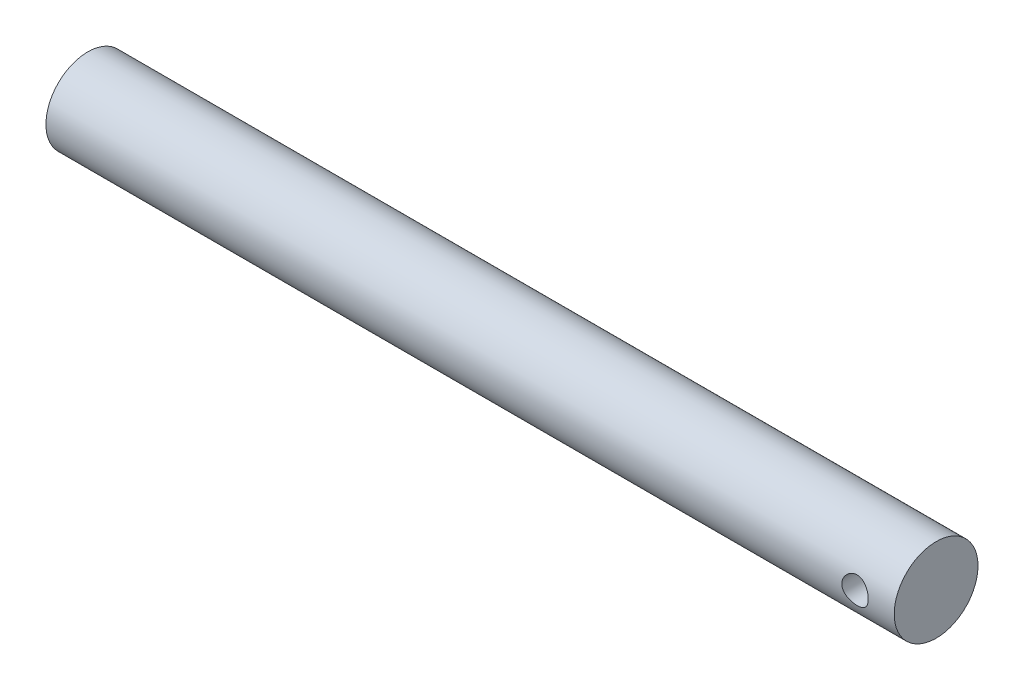
ISO-10303-21;
HEADER;
FILE_DESCRIPTION(('STEP AP214'),'2;1');
FILE_NAME('part.step','',(''),(''),'','','');
FILE_SCHEMA(('AUTOMOTIVE_DESIGN { 1 0 10303 214 1 1 1 1 }'));
ENDSEC;
DATA;
#1=APPLICATION_CONTEXT('core data for automotive mechanical design processes');
#2=APPLICATION_PROTOCOL_DEFINITION('international standard','automotive_design',2000,#1);
#3=PRODUCT_CONTEXT('',#1,'mechanical');
#4=PRODUCT('Part','Part','',(#3));
#5=PRODUCT_RELATED_PRODUCT_CATEGORY('part','',(#4));
#6=PRODUCT_DEFINITION_FORMATION('','',#4);
#7=PRODUCT_DEFINITION_CONTEXT('part definition',#1,'design');
#8=PRODUCT_DEFINITION('design','',#6,#7);
#9=PRODUCT_DEFINITION_SHAPE('','',#8);
#10=(LENGTH_UNIT() NAMED_UNIT(*) SI_UNIT(.MILLI.,.METRE.));
#11=(NAMED_UNIT(*) PLANE_ANGLE_UNIT() SI_UNIT($,.RADIAN.));
#12=(NAMED_UNIT(*) SI_UNIT($,.STERADIAN.) SOLID_ANGLE_UNIT());
#13=UNCERTAINTY_MEASURE_WITH_UNIT(LENGTH_MEASURE(1.E-05),#10,'distance_accuracy_value','');
#14=(GEOMETRIC_REPRESENTATION_CONTEXT(3) GLOBAL_UNCERTAINTY_ASSIGNED_CONTEXT((#13)) GLOBAL_UNIT_ASSIGNED_CONTEXT((#10,
#11,#12)) REPRESENTATION_CONTEXT('',''));
#15=CARTESIAN_POINT('',(0.,0.,0.));
#16=DIRECTION('',(0.,0.,1.));
#17=DIRECTION('',(1.,0.,0.));
#18=AXIS2_PLACEMENT_3D('',#15,#16,#17);
#19=CARTESIAN_POINT('',(203.2,0.,0.));
#20=DIRECTION('',(-1.,0.,0.));
#21=DIRECTION('',(0.,0.,1.));
#22=AXIS2_PLACEMENT_3D('',#19,#20,#21);
#23=CYLINDRICAL_SURFACE('',#22,10.033);
#24=CARTESIAN_POINT('',(196.977,0.,10.033));
#25=CARTESIAN_POINT('',(196.976999202598,-0.173724762827523,10.0329993597286));
#26=CARTESIAN_POINT('',(196.962694713612,-0.347458330826656,10.0284454349368));
#27=CARTESIAN_POINT('',(196.906009308974,-0.689837921385933,10.0107255184516));
#28=CARTESIAN_POINT('',(196.863622685165,-0.858482902318582,9.99755777586446));
#29=CARTESIAN_POINT('',(196.752350423952,-1.18569893455665,9.9640472849707));
#30=CARTESIAN_POINT('',(196.683506418906,-1.34428535915392,9.94371581340308));
#31=CARTESIAN_POINT('',(196.521452811089,-1.64766312119923,9.89797263047599));
#32=CARTESIAN_POINT('',(196.428239181954,-1.79245217363855,9.87256007978108));
#33=CARTESIAN_POINT('',(196.216994332223,-2.06869900766257,9.8184501603642));
#34=CARTESIAN_POINT('',(196.098332201369,-2.19965999348186,9.78967987955622));
#35=CARTESIAN_POINT('',(195.840901681813,-2.44019422634966,9.73251540764313));
#36=CARTESIAN_POINT('',(195.702129437195,-2.54976336224417,9.70412128980567));
#37=CARTESIAN_POINT('',(195.404085424461,-2.74712351592384,9.65013802368304));
#38=CARTESIAN_POINT('',(195.24438180378,-2.83428926593633,9.62463866003324));
#39=CARTESIAN_POINT('',(194.911644957712,-2.9803181516747,9.58043089482933));
#40=CARTESIAN_POINT('',(194.738615360298,-3.03918895926478,9.56172065281666));
#41=CARTESIAN_POINT('',(194.389752628873,-3.12513046595421,9.53397317415864));
#42=CARTESIAN_POINT('',(194.214169863087,-3.15312450269746,9.52465583640759));
#43=CARTESIAN_POINT('',(193.860571560782,-3.1794028380917,9.51591803804279));
#44=CARTESIAN_POINT('',(193.682556703338,-3.17769526704059,9.51649486907204));
#45=CARTESIAN_POINT('',(193.336828242823,-3.14534005043219,9.52723331949479));
#46=CARTESIAN_POINT('',(193.168990075437,-3.11587182116769,9.53700430424162));
#47=CARTESIAN_POINT('',(192.840774479841,-3.03074622038652,9.56439466851856));
#48=CARTESIAN_POINT('',(192.680397865074,-2.97508600079147,9.58201490155323));
#49=CARTESIAN_POINT('',(192.368872487517,-2.83833493613629,9.62341384316104));
#50=CARTESIAN_POINT('',(192.217896751812,-2.75687765598894,9.64728037174124));
#51=CARTESIAN_POINT('',(191.931372766981,-2.57109919369587,9.69844315263238));
#52=CARTESIAN_POINT('',(191.795828625182,-2.46677194591434,9.7257403140041));
#53=CARTESIAN_POINT('',(191.537354998608,-2.23245035707077,9.78225018249642));
#54=CARTESIAN_POINT('',(191.415311512894,-2.10148407823555,9.81149278113296));
#55=CARTESIAN_POINT('',(191.194701235263,-1.82058059851052,9.86747479007084));
#56=CARTESIAN_POINT('',(191.096136272302,-1.67064192108008,9.89421400526244));
#57=CARTESIAN_POINT('',(190.924660015046,-1.35431067811256,9.94246966128009));
#58=CARTESIAN_POINT('',(190.851964857105,-1.1877937096163,9.96394165412304));
#59=CARTESIAN_POINT('',(190.735883028316,-0.844056124776923,9.9989224262251));
#60=CARTESIAN_POINT('',(190.692487221851,-0.666838863607496,10.0124336874946));
#61=CARTESIAN_POINT('',(190.637756361389,-0.314248115446341,10.0295690639536));
#62=CARTESIAN_POINT('',(190.625222302901,-0.139078435551168,10.0335627369056));
#63=CARTESIAN_POINT('',(190.629183683093,0.210882754898693,10.0323087902416));
#64=CARTESIAN_POINT('',(190.645674760864,0.385674318313354,10.0270625588833));
#65=CARTESIAN_POINT('',(190.706258154418,0.725260604850788,10.0081613548351));
#66=CARTESIAN_POINT('',(190.749632858837,0.890196703486057,9.99472514878789));
#67=CARTESIAN_POINT('',(190.861872639422,1.21040074708556,9.96102205245852));
#68=CARTESIAN_POINT('',(190.930740886829,1.36566748643207,9.94075431240322));
#69=CARTESIAN_POINT('',(191.093916348603,1.6664030968329,9.89484295136149));
#70=CARTESIAN_POINT('',(191.188811224405,1.81153417504005,9.86907864631155));
#71=CARTESIAN_POINT('',(191.400643981747,2.08421228994196,9.81511591431324));
#72=CARTESIAN_POINT('',(191.51758798539,2.2117544258676,9.78691681250723));
#73=CARTESIAN_POINT('',(191.775839627443,2.45102525037071,9.72981619972594));
#74=CARTESIAN_POINT('',(191.917945154146,2.56189905066963,9.70093281275661));
#75=CARTESIAN_POINT('',(192.219371608827,2.75830840151296,9.64692879179202));
#76=CARTESIAN_POINT('',(192.378692330306,2.84384425594351,9.62180811267119));
#77=CARTESIAN_POINT('',(192.709763177556,2.98663912236098,9.57844759898918));
#78=CARTESIAN_POINT('',(192.881466293699,3.04399922774385,9.56018322077986));
#79=CARTESIAN_POINT('',(193.232793424281,3.12877761204883,9.53277836340231));
#80=CARTESIAN_POINT('',(193.41241429585,3.15620766199891,9.52363429747794));
#81=CARTESIAN_POINT('',(193.765522737426,3.17948802180479,9.51588558872206));
#82=CARTESIAN_POINT('',(193.938908479951,3.17674373792488,9.51681188312783));
#83=CARTESIAN_POINT('',(194.282617278813,3.1431583133383,9.5279562714898));
#84=CARTESIAN_POINT('',(194.452940484509,3.11231854664135,9.53817391105267));
#85=CARTESIAN_POINT('',(194.783105827586,3.02436878335259,9.56641784431471));
#86=CARTESIAN_POINT('',(194.943068991394,2.96767072375091,9.58432144317396));
#87=CARTESIAN_POINT('',(195.251338907367,2.82993972574053,9.6258859759527));
#88=CARTESIAN_POINT('',(195.399643237621,2.74890174791939,9.6495481019429));
#89=CARTESIAN_POINT('',(195.686805320111,2.56100382886962,9.70114364798429));
#90=CARTESIAN_POINT('',(195.825048383787,2.45324108875609,9.72921000887471));
#91=CARTESIAN_POINT('',(196.081943843766,2.21652955825324,9.78585079278358));
#92=CARTESIAN_POINT('',(196.200590929142,2.08757504327137,9.81442535121773));
#93=CARTESIAN_POINT('',(196.418945358509,1.8068992411063,9.87002146469636));
#94=CARTESIAN_POINT('',(196.517877201541,1.6545558689923,9.89695791058207));
#95=CARTESIAN_POINT('',(196.688599655078,1.33454986526124,9.94515898668513));
#96=CARTESIAN_POINT('',(196.760400262296,1.16689290438258,9.96642570510502));
#97=CARTESIAN_POINT('',(196.870009300319,0.834377684785862,9.99953158123751));
#98=CARTESIAN_POINT('',(196.910012922944,0.670301482807507,10.0119715096199));
#99=CARTESIAN_POINT('',(196.963505812016,0.337485616650549,10.0287051549403));
#100=CARTESIAN_POINT('',(196.977000774554,0.168746962227797,10.0330006219255));
#101=CARTESIAN_POINT('',(196.977,0.,10.033));
#102=B_SPLINE_CURVE_WITH_KNOTS('',3,(#24,#25,#26,#27,#28,#29,#30,#31,#32,#33,#34,#35,#36,#37,
#38,#39,#40,#41,#42,#43,#44,#45,#46,#47,#48,#49,#50,#51,#52,#53,#54,#55,#56,#57,#58,#59,#60,#61,
#62,#63,#64,#65,#66,#67,#68,#69,#70,#71,#72,#73,#74,#75,#76,#77,#78,#79,#80,#81,#82,#83,#84,#85,
#86,#87,#88,#89,#90,#91,#92,#93,#94,#95,#96,#97,#98,#99,#100,#101),.UNSPECIFIED.,.T.,.F.,(4,2,2,
2,2,2,2,2,2,2,2,2,2,2,2,2,2,2,2,2,2,2,2,2,2,2,2,2,2,2,2,2,2,2,2,2,2,2,4),(0.,0.520553895680028,
1.04121363499819,1.56105741595769,2.08098714014228,2.61571678224293,3.15054908945211,
3.69899378730087,4.2472896963603,4.77870312196457,5.3099710846875,5.81963970454199,
6.32936375782102,6.84668003839646,7.36413368937993,7.905778782519,8.44746605553607,
8.99357825349241,9.53952009344051,10.0638912611273,10.5881836509133,11.0990502466535,
11.6099804124547,12.1335615064167,12.6572881911727,13.2023307259129,13.7473667235183,
14.2904326049271,14.8332848298554,15.3509643768596,15.8686186081016,16.3782997947953,
16.8880865802966,17.4182537960865,17.9485644635372,18.4967955109767,19.044824361045,
19.5505713163423,20.0562095865701),.UNSPECIFIED.);
#103=CARTESIAN_POINT('',(196.977,0.,10.033));
#104=VERTEX_POINT('',#103);
#105=EDGE_CURVE('E34',#104,#104,#102,.T.);
#106=ORIENTED_EDGE('',*,*,#105,.T.);
#107=EDGE_LOOP('',(#106));
#108=FACE_BOUND('',#107,.T.);
#109=CARTESIAN_POINT('',(196.977,0.,-10.033));
#110=CARTESIAN_POINT('',(196.976999202598,0.173724762827524,-10.0329993597286));
#111=CARTESIAN_POINT('',(196.962694713612,0.347458330826658,-10.0284454349368));
#112=CARTESIAN_POINT('',(196.906009308974,0.689837921385935,-10.0107255184516));
#113=CARTESIAN_POINT('',(196.863622685165,0.858482902318584,-9.99755777586446));
#114=CARTESIAN_POINT('',(196.752350423952,1.18569893455665,-9.9640472849707));
#115=CARTESIAN_POINT('',(196.683506418906,1.34428535915393,-9.94371581340308));
#116=CARTESIAN_POINT('',(196.521452811089,1.64766312119923,-9.89797263047599));
#117=CARTESIAN_POINT('',(196.428239181954,1.79245217363855,-9.87256007978108));
#118=CARTESIAN_POINT('',(196.216994332223,2.06869900766258,-9.8184501603642));
#119=CARTESIAN_POINT('',(196.098332201369,2.19965999348186,-9.78967987955622));
#120=CARTESIAN_POINT('',(195.840901681813,2.44019422634966,-9.73251540764313));
#121=CARTESIAN_POINT('',(195.702129437195,2.54976336224417,-9.70412128980567));
#122=CARTESIAN_POINT('',(195.404085424461,2.74712351592384,-9.65013802368304));
#123=CARTESIAN_POINT('',(195.24438180378,2.83428926593634,-9.62463866003324));
#124=CARTESIAN_POINT('',(194.911644957712,2.98031815167471,-9.58043089482933));
#125=CARTESIAN_POINT('',(194.738615360298,3.03918895926479,-9.56172065281666));
#126=CARTESIAN_POINT('',(194.389752628873,3.12513046595421,-9.53397317415864));
#127=CARTESIAN_POINT('',(194.214169863087,3.15312450269746,-9.52465583640759));
#128=CARTESIAN_POINT('',(193.860571560782,3.17940283809171,-9.51591803804279));
#129=CARTESIAN_POINT('',(193.682556703338,3.1776952670406,-9.51649486907204));
#130=CARTESIAN_POINT('',(193.336828242823,3.14534005043219,-9.52723331949478));
#131=CARTESIAN_POINT('',(193.168990075437,3.1158718211677,-9.53700430424161));
#132=CARTESIAN_POINT('',(192.840774479841,3.03074622038652,-9.56439466851856));
#133=CARTESIAN_POINT('',(192.680397865074,2.97508600079147,-9.58201490155322));
#134=CARTESIAN_POINT('',(192.368872487517,2.83833493613629,-9.62341384316103));
#135=CARTESIAN_POINT('',(192.217896751812,2.75687765598894,-9.64728037174124));
#136=CARTESIAN_POINT('',(191.931372766981,2.57109919369587,-9.69844315263238));
#137=CARTESIAN_POINT('',(191.795828625182,2.46677194591434,-9.7257403140041));
#138=CARTESIAN_POINT('',(191.537354998608,2.23245035707077,-9.78225018249642));
#139=CARTESIAN_POINT('',(191.415311512894,2.10148407823554,-9.81149278113296));
#140=CARTESIAN_POINT('',(191.194701235263,1.82058059851051,-9.86747479007084));
#141=CARTESIAN_POINT('',(191.096136272302,1.67064192108008,-9.89421400526244));
#142=CARTESIAN_POINT('',(190.924660015046,1.35431067811256,-9.94246966128009));
#143=CARTESIAN_POINT('',(190.851964857105,1.18779370961631,-9.96394165412304));
#144=CARTESIAN_POINT('',(190.735883028316,0.844056124776929,-9.9989224262251));
#145=CARTESIAN_POINT('',(190.692487221851,0.666838863607502,-10.0124336874946));
#146=CARTESIAN_POINT('',(190.637756361389,0.314248115446348,-10.0295690639536));
#147=CARTESIAN_POINT('',(190.625222302901,0.139078435551176,-10.0335627369056));
#148=CARTESIAN_POINT('',(190.629183683093,-0.210882754898685,-10.0323087902416));
#149=CARTESIAN_POINT('',(190.645674760864,-0.385674318313345,-10.0270625588833));
#150=CARTESIAN_POINT('',(190.706258154418,-0.72526060485078,-10.0081613548351));
#151=CARTESIAN_POINT('',(190.749632858837,-0.89019670348605,-9.99472514878789));
#152=CARTESIAN_POINT('',(190.861872639422,-1.21040074708555,-9.96102205245852));
#153=CARTESIAN_POINT('',(190.930740886829,-1.36566748643206,-9.94075431240322));
#154=CARTESIAN_POINT('',(191.093916348603,-1.66640309683289,-9.89484295136149));
#155=CARTESIAN_POINT('',(191.188811224405,-1.81153417504005,-9.86907864631155));
#156=CARTESIAN_POINT('',(191.400643981747,-2.08421228994196,-9.81511591431324));
#157=CARTESIAN_POINT('',(191.51758798539,-2.21175442586759,-9.78691681250724));
#158=CARTESIAN_POINT('',(191.775839627443,-2.45102525037069,-9.72981619972594));
#159=CARTESIAN_POINT('',(191.917945154146,-2.56189905066962,-9.70093281275661));
#160=CARTESIAN_POINT('',(192.219371608827,-2.75830840151296,-9.64692879179202));
#161=CARTESIAN_POINT('',(192.378692330306,-2.8438442559435,-9.62180811267119));
#162=CARTESIAN_POINT('',(192.709763177556,-2.98663912236098,-9.57844759898918));
#163=CARTESIAN_POINT('',(192.881466293699,-3.04399922774385,-9.56018322077986));
#164=CARTESIAN_POINT('',(193.232793424281,-3.12877761204883,-9.53277836340231));
#165=CARTESIAN_POINT('',(193.41241429585,-3.15620766199891,-9.52363429747794));
#166=CARTESIAN_POINT('',(193.765522737426,-3.17948802180478,-9.51588558872206));
#167=CARTESIAN_POINT('',(193.938908479951,-3.17674373792488,-9.51681188312784));
#168=CARTESIAN_POINT('',(194.282617278813,-3.1431583133383,-9.5279562714898));
#169=CARTESIAN_POINT('',(194.452940484509,-3.11231854664135,-9.53817391105267));
#170=CARTESIAN_POINT('',(194.783105827586,-3.02436878335259,-9.56641784431471));
#171=CARTESIAN_POINT('',(194.943068991394,-2.96767072375091,-9.58432144317396));
#172=CARTESIAN_POINT('',(195.251338907367,-2.82993972574053,-9.6258859759527));
#173=CARTESIAN_POINT('',(195.399643237621,-2.74890174791939,-9.6495481019429));
#174=CARTESIAN_POINT('',(195.686805320111,-2.56100382886962,-9.70114364798429));
#175=CARTESIAN_POINT('',(195.825048383787,-2.45324108875609,-9.72921000887471));
#176=CARTESIAN_POINT('',(196.081943843766,-2.21652955825324,-9.78585079278358));
#177=CARTESIAN_POINT('',(196.200590929142,-2.08757504327137,-9.81442535121773));
#178=CARTESIAN_POINT('',(196.418945358509,-1.80689924110631,-9.87002146469636));
#179=CARTESIAN_POINT('',(196.517877201541,-1.65455586899231,-9.89695791058207));
#180=CARTESIAN_POINT('',(196.688599655078,-1.33454986526126,-9.94515898668513));
#181=CARTESIAN_POINT('',(196.760400262296,-1.1668929043826,-9.96642570510502));
#182=CARTESIAN_POINT('',(196.870009300319,-0.83437768478587,-9.99953158123751));
#183=CARTESIAN_POINT('',(196.910012922944,-0.670301482807512,-10.0119715096199));
#184=CARTESIAN_POINT('',(196.963505812016,-0.337485616650549,-10.0287051549403));
#185=CARTESIAN_POINT('',(196.977000774554,-0.168746962227797,-10.0330006219255));
#186=CARTESIAN_POINT('',(196.977,0.,-10.033));
#187=B_SPLINE_CURVE_WITH_KNOTS('',3,(#109,#110,#111,#112,#113,#114,#115,#116,#117,#118,#119,
#120,#121,#122,#123,#124,#125,#126,#127,#128,#129,#130,#131,#132,#133,#134,#135,#136,#137,#138,
#139,#140,#141,#142,#143,#144,#145,#146,#147,#148,#149,#150,#151,#152,#153,#154,#155,#156,#157,
#158,#159,#160,#161,#162,#163,#164,#165,#166,#167,#168,#169,#170,#171,#172,#173,#174,#175,#176,
#177,#178,#179,#180,#181,#182,#183,#184,#185,#186),.UNSPECIFIED.,.T.,.F.,(4,2,2,2,2,2,2,2,2,2,2,
2,2,2,2,2,2,2,2,2,2,2,2,2,2,2,2,2,2,2,2,2,2,2,2,2,2,2,4),(0.,0.520553895680028,1.04121363499819,
1.56105741595769,2.08098714014228,2.61571678224293,3.15054908945211,3.69899378730088,
4.24728969636031,4.77870312196455,5.30997108468747,5.81963970454199,6.32936375782102,
6.84668003839646,7.36413368937993,7.90577878251904,8.44746605553607,8.99357825349241,
9.53952009344051,10.0638912611273,10.5881836509133,11.0990502466535,11.6099804124547,
12.1335615064167,12.6572881911727,13.2023307259129,13.7473667235183,14.2904326049271,
14.8332848298554,15.3509643768596,15.8686186081016,16.3782997947953,16.8880865802966,
17.4182537960865,17.9485644635372,18.4967955109767,19.044824361045,19.5505713163423,
20.0562095865701),.UNSPECIFIED.);
#188=CARTESIAN_POINT('',(196.977,0.,-10.033));
#189=VERTEX_POINT('',#188);
#190=EDGE_CURVE('E47',#189,#189,#187,.T.);
#191=ORIENTED_EDGE('',*,*,#190,.T.);
#192=EDGE_LOOP('',(#191));
#193=FACE_BOUND('',#192,.T.);
#194=CARTESIAN_POINT('',(203.2,0.,0.));
#195=DIRECTION('',(1.,0.,0.));
#196=DIRECTION('',(0.,0.,-1.));
#197=AXIS2_PLACEMENT_3D('',#194,#195,#196);
#198=CIRCLE('',#197,10.033);
#199=CARTESIAN_POINT('',(203.2,0.,-10.033));
#200=VERTEX_POINT('',#199);
#201=EDGE_CURVE('E10',#200,#200,#198,.T.);
#202=ORIENTED_EDGE('',*,*,#201,.F.);
#203=EDGE_LOOP('',(#202));
#204=FACE_BOUND('',#203,.T.);
#205=CARTESIAN_POINT('',(0.,0.,0.));
#206=DIRECTION('',(1.,0.,0.));
#207=DIRECTION('',(0.,0.,-1.));
#208=AXIS2_PLACEMENT_3D('',#205,#206,#207);
#209=CIRCLE('',#208,10.033);
#210=CARTESIAN_POINT('',(0.,0.,-10.033));
#211=VERTEX_POINT('',#210);
#212=EDGE_CURVE('E41',#211,#211,#209,.T.);
#213=ORIENTED_EDGE('',*,*,#212,.T.);
#214=EDGE_LOOP('',(#213));
#215=FACE_BOUND('',#214,.T.);
#216=ADVANCED_FACE('F30',(#108,#193,#204,#215),#23,.T.);
#217=CARTESIAN_POINT('',(203.2,0.,0.));
#218=DIRECTION('',(1.,0.,0.));
#219=DIRECTION('',(0.,0.,-1.));
#220=AXIS2_PLACEMENT_3D('',#217,#218,#219);
#221=PLANE('',#220);
#222=ORIENTED_EDGE('',*,*,#201,.T.);
#223=EDGE_LOOP('',(#222));
#224=FACE_BOUND('',#223,.T.);
#225=ADVANCED_FACE('F57',(#224),#221,.T.);
#226=CARTESIAN_POINT('',(0.,0.,0.));
#227=DIRECTION('',(1.,0.,0.));
#228=DIRECTION('',(0.,0.,-1.));
#229=AXIS2_PLACEMENT_3D('',#226,#227,#228);
#230=PLANE('',#229);
#231=ORIENTED_EDGE('',*,*,#212,.F.);
#232=EDGE_LOOP('',(#231));
#233=FACE_BOUND('',#232,.T.);
#234=ADVANCED_FACE('F55',(#233),#230,.F.);
#235=CARTESIAN_POINT('',(193.802,0.,-12.7));
#236=DIRECTION('',(0.,0.,1.));
#237=DIRECTION('',(1.,0.,0.));
#238=AXIS2_PLACEMENT_3D('',#235,#236,#237);
#239=CYLINDRICAL_SURFACE('',#238,3.175);
#240=ORIENTED_EDGE('',*,*,#190,.F.);
#241=EDGE_LOOP('',(#240));
#242=FACE_BOUND('',#241,.T.);
#243=ORIENTED_EDGE('',*,*,#105,.F.);
#244=EDGE_LOOP('',(#243));
#245=FACE_BOUND('',#244,.T.);
#246=ADVANCED_FACE('F51',(#242,#245),#239,.F.);
#247=CLOSED_SHELL('',(#216,#225,#234,#246));
#248=MANIFOLD_SOLID_BREP('B2',#247);
#249=ADVANCED_BREP_SHAPE_REPRESENTATION('',(#18,#248),#14);
#250=SHAPE_DEFINITION_REPRESENTATION(#9,#249);
ENDSEC;
END-ISO-10303-21;
